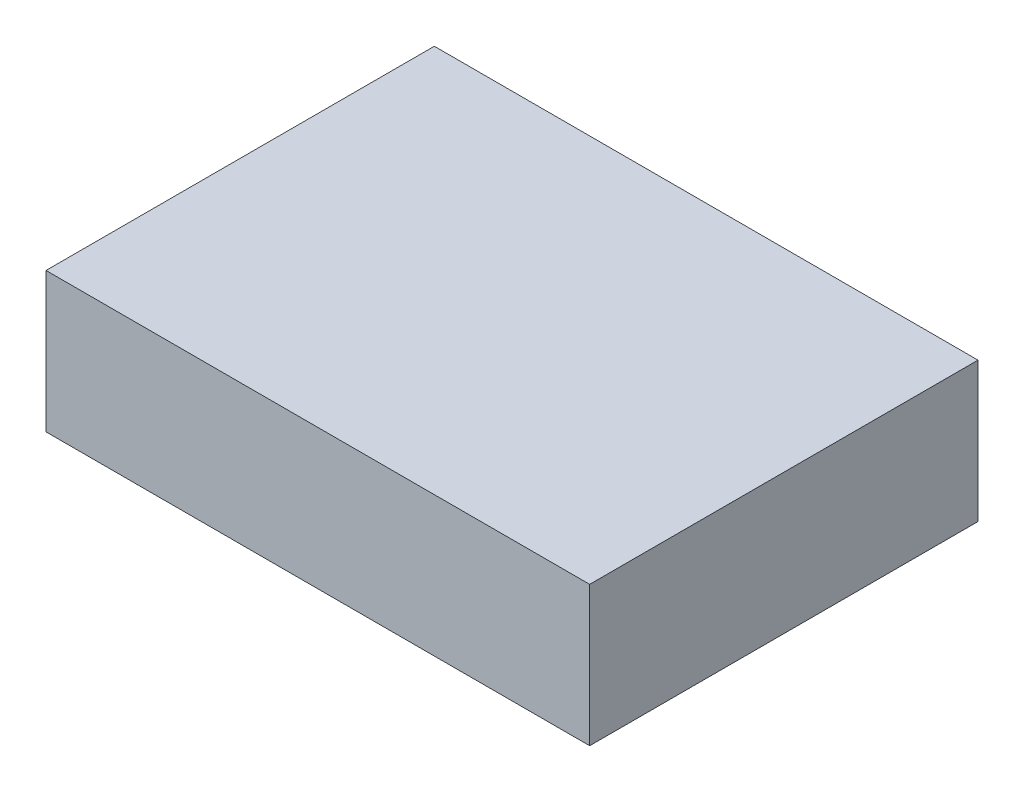
ISO-10303-21;
HEADER;
FILE_DESCRIPTION(('STEP AP214'),'2;1');
FILE_NAME('part.step','',(''),(''),'','','');
FILE_SCHEMA(('AUTOMOTIVE_DESIGN { 1 0 10303 214 1 1 1 1 }'));
ENDSEC;
DATA;
#1=APPLICATION_CONTEXT('core data for automotive mechanical design processes');
#2=APPLICATION_PROTOCOL_DEFINITION('international standard','automotive_design',2000,#1);
#3=PRODUCT_CONTEXT('',#1,'mechanical');
#4=PRODUCT('Part','Part','',(#3));
#5=PRODUCT_RELATED_PRODUCT_CATEGORY('part','',(#4));
#6=PRODUCT_DEFINITION_FORMATION('','',#4);
#7=PRODUCT_DEFINITION_CONTEXT('part definition',#1,'design');
#8=PRODUCT_DEFINITION('design','',#6,#7);
#9=PRODUCT_DEFINITION_SHAPE('','',#8);
#10=(LENGTH_UNIT() NAMED_UNIT(*) SI_UNIT(.MILLI.,.METRE.));
#11=(NAMED_UNIT(*) PLANE_ANGLE_UNIT() SI_UNIT($,.RADIAN.));
#12=(NAMED_UNIT(*) SI_UNIT($,.STERADIAN.) SOLID_ANGLE_UNIT());
#13=UNCERTAINTY_MEASURE_WITH_UNIT(LENGTH_MEASURE(1.E-05),#10,'distance_accuracy_value','');
#14=(GEOMETRIC_REPRESENTATION_CONTEXT(3) GLOBAL_UNCERTAINTY_ASSIGNED_CONTEXT((#13)) GLOBAL_UNIT_ASSIGNED_CONTEXT((#10,
#11,#12)) REPRESENTATION_CONTEXT('',''));
#15=CARTESIAN_POINT('',(0.,0.,0.));
#16=DIRECTION('',(0.,0.,1.));
#17=DIRECTION('',(1.,0.,0.));
#18=AXIS2_PLACEMENT_3D('',#15,#16,#17);
#19=CARTESIAN_POINT('',(-35.,18.,25.));
#20=DIRECTION('',(1.,0.,0.));
#21=DIRECTION('',(0.,0.,-1.));
#22=AXIS2_PLACEMENT_3D('',#19,#20,#21);
#23=PLANE('',#22);
#24=DIRECTION('',(0.,0.,1.));
#25=VECTOR('',#24,1.);
#26=CARTESIAN_POINT('',(-35.,0.,25.));
#27=LINE('',#26,#25);
#28=CARTESIAN_POINT('',(-35.,0.,-25.));
#29=VERTEX_POINT('',#28);
#30=CARTESIAN_POINT('',(-35.,0.,25.));
#31=VERTEX_POINT('',#30);
#32=EDGE_CURVE('E95',#29,#31,#27,.T.);
#33=ORIENTED_EDGE('',*,*,#32,.T.);
#34=DIRECTION('',(0.,-1.,0.));
#35=VECTOR('',#34,1.);
#36=CARTESIAN_POINT('',(-35.,18.,25.));
#37=LINE('',#36,#35);
#38=CARTESIAN_POINT('',(-35.,18.,25.));
#39=VERTEX_POINT('',#38);
#40=EDGE_CURVE('E11',#39,#31,#37,.T.);
#41=ORIENTED_EDGE('',*,*,#40,.F.);
#42=DIRECTION('',(0.,0.,1.));
#43=VECTOR('',#42,1.);
#44=CARTESIAN_POINT('',(-35.,18.,25.));
#45=LINE('',#44,#43);
#46=CARTESIAN_POINT('',(-35.,18.,-25.));
#47=VERTEX_POINT('',#46);
#48=EDGE_CURVE('E83',#47,#39,#45,.T.);
#49=ORIENTED_EDGE('',*,*,#48,.F.);
#50=DIRECTION('',(0.,-1.,0.));
#51=VECTOR('',#50,1.);
#52=CARTESIAN_POINT('',(-35.,18.,-25.));
#53=LINE('',#52,#51);
#54=EDGE_CURVE('E91',#47,#29,#53,.T.);
#55=ORIENTED_EDGE('',*,*,#54,.T.);
#56=EDGE_LOOP('',(#33,#41,#49,#55));
#57=FACE_BOUND('',#56,.T.);
#58=ADVANCED_FACE('F32',(#57),#23,.F.);
#59=CARTESIAN_POINT('',(35.,18.,25.));
#60=DIRECTION('',(0.,0.,-1.));
#61=DIRECTION('',(-1.,0.,0.));
#62=AXIS2_PLACEMENT_3D('',#59,#60,#61);
#63=PLANE('',#62);
#64=DIRECTION('',(1.,0.,0.));
#65=VECTOR('',#64,1.);
#66=CARTESIAN_POINT('',(35.,0.,25.));
#67=LINE('',#66,#65);
#68=CARTESIAN_POINT('',(35.,0.,25.));
#69=VERTEX_POINT('',#68);
#70=EDGE_CURVE('E87',#31,#69,#67,.T.);
#71=ORIENTED_EDGE('',*,*,#70,.T.);
#72=DIRECTION('',(0.,-1.,0.));
#73=VECTOR('',#72,1.);
#74=CARTESIAN_POINT('',(35.,18.,25.));
#75=LINE('',#74,#73);
#76=CARTESIAN_POINT('',(35.,18.,25.));
#77=VERTEX_POINT('',#76);
#78=EDGE_CURVE('E40',#77,#69,#75,.T.);
#79=ORIENTED_EDGE('',*,*,#78,.F.);
#80=DIRECTION('',(1.,0.,0.));
#81=VECTOR('',#80,1.);
#82=CARTESIAN_POINT('',(35.,18.,25.));
#83=LINE('',#82,#81);
#84=EDGE_CURVE('E78',#39,#77,#83,.T.);
#85=ORIENTED_EDGE('',*,*,#84,.F.);
#86=ORIENTED_EDGE('',*,*,#40,.T.);
#87=EDGE_LOOP('',(#71,#79,#85,#86));
#88=FACE_BOUND('',#87,.T.);
#89=ADVANCED_FACE('F86',(#88),#63,.F.);
#90=CARTESIAN_POINT('',(35.,18.,25.));
#91=DIRECTION('',(-1.,0.,0.));
#92=DIRECTION('',(0.,0.,1.));
#93=AXIS2_PLACEMENT_3D('',#90,#91,#92);
#94=PLANE('',#93);
#95=DIRECTION('',(0.,0.,-1.));
#96=VECTOR('',#95,1.);
#97=CARTESIAN_POINT('',(35.,0.,25.));
#98=LINE('',#97,#96);
#99=CARTESIAN_POINT('',(35.,0.,-25.));
#100=VERTEX_POINT('',#99);
#101=EDGE_CURVE('E65',#69,#100,#98,.T.);
#102=ORIENTED_EDGE('',*,*,#101,.T.);
#103=DIRECTION('',(0.,-1.,0.));
#104=VECTOR('',#103,1.);
#105=CARTESIAN_POINT('',(35.,18.,-25.));
#106=LINE('',#105,#104);
#107=CARTESIAN_POINT('',(35.,18.,-25.));
#108=VERTEX_POINT('',#107);
#109=EDGE_CURVE('E88',#108,#100,#106,.T.);
#110=ORIENTED_EDGE('',*,*,#109,.F.);
#111=DIRECTION('',(0.,0.,-1.));
#112=VECTOR('',#111,1.);
#113=CARTESIAN_POINT('',(35.,18.,25.));
#114=LINE('',#113,#112);
#115=EDGE_CURVE('E81',#77,#108,#114,.T.);
#116=ORIENTED_EDGE('',*,*,#115,.F.);
#117=ORIENTED_EDGE('',*,*,#78,.T.);
#118=EDGE_LOOP('',(#102,#110,#116,#117));
#119=FACE_BOUND('',#118,.T.);
#120=ADVANCED_FACE('F89',(#119),#94,.F.);
#121=CARTESIAN_POINT('',(35.,18.,-25.));
#122=DIRECTION('',(0.,0.,1.));
#123=DIRECTION('',(1.,0.,0.));
#124=AXIS2_PLACEMENT_3D('',#121,#122,#123);
#125=PLANE('',#124);
#126=DIRECTION('',(-1.,0.,0.));
#127=VECTOR('',#126,1.);
#128=CARTESIAN_POINT('',(35.,0.,-25.));
#129=LINE('',#128,#127);
#130=EDGE_CURVE('E71',#100,#29,#129,.T.);
#131=ORIENTED_EDGE('',*,*,#130,.T.);
#132=ORIENTED_EDGE('',*,*,#54,.F.);
#133=DIRECTION('',(-1.,0.,0.));
#134=VECTOR('',#133,1.);
#135=CARTESIAN_POINT('',(35.,18.,-25.));
#136=LINE('',#135,#134);
#137=EDGE_CURVE('E48',#108,#47,#136,.T.);
#138=ORIENTED_EDGE('',*,*,#137,.F.);
#139=ORIENTED_EDGE('',*,*,#109,.T.);
#140=EDGE_LOOP('',(#131,#132,#138,#139));
#141=FACE_BOUND('',#140,.T.);
#142=ADVANCED_FACE('F102',(#141),#125,.F.);
#143=CARTESIAN_POINT('',(0.,18.,0.));
#144=DIRECTION('',(0.,1.,0.));
#145=DIRECTION('',(0.,0.,1.));
#146=AXIS2_PLACEMENT_3D('',#143,#144,#145);
#147=PLANE('',#146);
#148=ORIENTED_EDGE('',*,*,#48,.T.);
#149=ORIENTED_EDGE('',*,*,#84,.T.);
#150=ORIENTED_EDGE('',*,*,#115,.T.);
#151=ORIENTED_EDGE('',*,*,#137,.T.);
#152=EDGE_LOOP('',(#148,#149,#150,#151));
#153=FACE_BOUND('',#152,.T.);
#154=ADVANCED_FACE('F79',(#153),#147,.T.);
#155=CARTESIAN_POINT('',(0.,0.,0.));
#156=DIRECTION('',(0.,1.,0.));
#157=DIRECTION('',(0.,0.,1.));
#158=AXIS2_PLACEMENT_3D('',#155,#156,#157);
#159=PLANE('',#158);
#160=ORIENTED_EDGE('',*,*,#32,.F.);
#161=ORIENTED_EDGE('',*,*,#130,.F.);
#162=ORIENTED_EDGE('',*,*,#101,.F.);
#163=ORIENTED_EDGE('',*,*,#70,.F.);
#164=EDGE_LOOP('',(#160,#161,#162,#163));
#165=FACE_BOUND('',#164,.T.);
#166=ADVANCED_FACE('F105',(#165),#159,.F.);
#167=CLOSED_SHELL('',(#58,#89,#120,#142,#154,#166));
#168=MANIFOLD_SOLID_BREP('B2',#167);
#169=ADVANCED_BREP_SHAPE_REPRESENTATION('',(#18,#168),#14);
#170=SHAPE_DEFINITION_REPRESENTATION(#9,#169);
ENDSEC;
END-ISO-10303-21;
